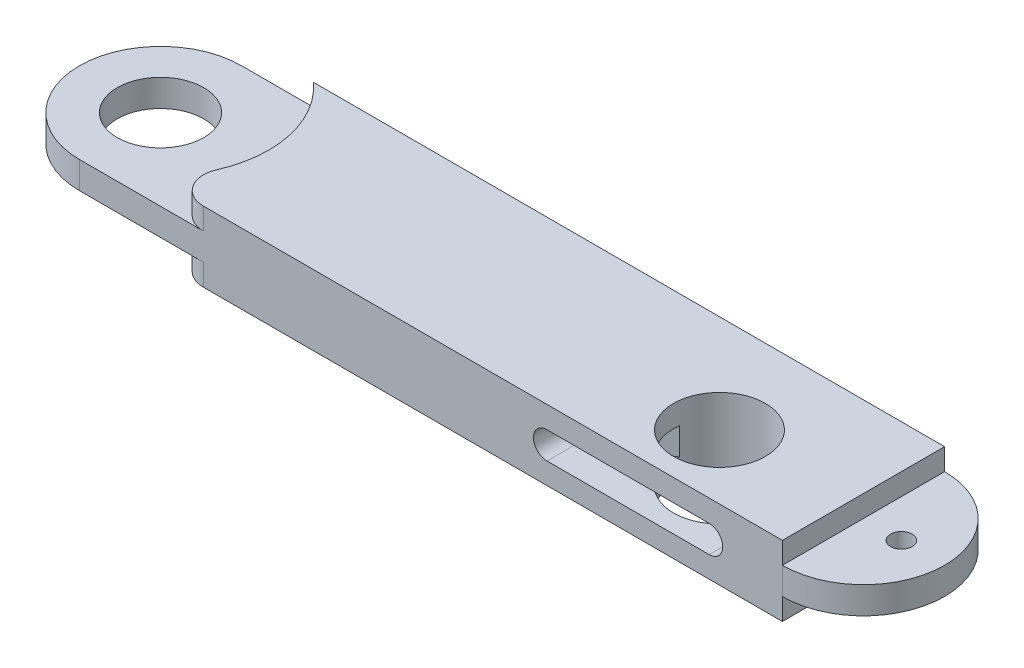
ISO-10303-21;
HEADER;
FILE_DESCRIPTION(('STEP AP214'),'2;1');
FILE_NAME('part.step','',(''),(''),'','','');
FILE_SCHEMA(('AUTOMOTIVE_DESIGN { 1 0 10303 214 1 1 1 1 }'));
ENDSEC;
DATA;
#1=APPLICATION_CONTEXT('core data for automotive mechanical design processes');
#2=APPLICATION_PROTOCOL_DEFINITION('international standard','automotive_design',2000,#1);
#3=PRODUCT_CONTEXT('',#1,'mechanical');
#4=PRODUCT('Part','Part','',(#3));
#5=PRODUCT_RELATED_PRODUCT_CATEGORY('part','',(#4));
#6=PRODUCT_DEFINITION_FORMATION('','',#4);
#7=PRODUCT_DEFINITION_CONTEXT('part definition',#1,'design');
#8=PRODUCT_DEFINITION('design','',#6,#7);
#9=PRODUCT_DEFINITION_SHAPE('','',#8);
#10=(LENGTH_UNIT() NAMED_UNIT(*) SI_UNIT(.MILLI.,.METRE.));
#11=(NAMED_UNIT(*) PLANE_ANGLE_UNIT() SI_UNIT($,.RADIAN.));
#12=(NAMED_UNIT(*) SI_UNIT($,.STERADIAN.) SOLID_ANGLE_UNIT());
#13=UNCERTAINTY_MEASURE_WITH_UNIT(LENGTH_MEASURE(1.E-05),#10,'distance_accuracy_value','');
#14=(GEOMETRIC_REPRESENTATION_CONTEXT(3) GLOBAL_UNCERTAINTY_ASSIGNED_CONTEXT((#13)) GLOBAL_UNIT_ASSIGNED_CONTEXT((#10,
#11,#12)) REPRESENTATION_CONTEXT('',''));
#15=CARTESIAN_POINT('',(0.,0.,0.));
#16=DIRECTION('',(0.,0.,1.));
#17=DIRECTION('',(1.,0.,0.));
#18=AXIS2_PLACEMENT_3D('',#15,#16,#17);
#19=CARTESIAN_POINT('',(0.,13.,0.));
#20=DIRECTION('',(0.,-1.,0.));
#21=DIRECTION('',(0.,0.,-1.));
#22=AXIS2_PLACEMENT_3D('',#19,#20,#21);
#23=CYLINDRICAL_SURFACE('',#22,15.);
#24=CARTESIAN_POINT('',(0.,4.,0.));
#25=DIRECTION('',(0.,-1.,0.));
#26=DIRECTION('',(0.,0.,-1.));
#27=AXIS2_PLACEMENT_3D('',#24,#25,#26);
#28=CIRCLE('',#27,15.);
#29=CARTESIAN_POINT('',(0.,4.,15.));
#30=VERTEX_POINT('',#29);
#31=CARTESIAN_POINT('',(0.,4.,-15.));
#32=VERTEX_POINT('',#31);
#33=EDGE_CURVE('E685',#30,#32,#28,.T.);
#34=ORIENTED_EDGE('',*,*,#33,.F.);
#35=DIRECTION('',(0.,-1.,0.));
#36=VECTOR('',#35,1.);
#37=CARTESIAN_POINT('',(0.,13.,15.));
#38=LINE('',#37,#36);
#39=CARTESIAN_POINT('',(0.,8.99999999999999,15.));
#40=VERTEX_POINT('',#39);
#41=EDGE_CURVE('E225',#40,#30,#38,.T.);
#42=ORIENTED_EDGE('',*,*,#41,.F.);
#43=CARTESIAN_POINT('',(0.,8.99999999999999,0.));
#44=DIRECTION('',(0.,1.,0.));
#45=DIRECTION('',(0.,0.,1.));
#46=AXIS2_PLACEMENT_3D('',#43,#44,#45);
#47=CIRCLE('',#46,15.);
#48=CARTESIAN_POINT('',(0.,8.99999999999999,-15.));
#49=VERTEX_POINT('',#48);
#50=EDGE_CURVE('E408',#49,#40,#47,.T.);
#51=ORIENTED_EDGE('',*,*,#50,.F.);
#52=DIRECTION('',(0.,-1.,0.));
#53=VECTOR('',#52,1.);
#54=CARTESIAN_POINT('',(0.,13.,-15.));
#55=LINE('',#54,#53);
#56=EDGE_CURVE('E212',#49,#32,#55,.T.);
#57=ORIENTED_EDGE('',*,*,#56,.T.);
#58=EDGE_LOOP('',(#34,#42,#51,#57));
#59=FACE_BOUND('',#58,.T.);
#60=ADVANCED_FACE('F38',(#59),#23,.T.);
#61=CARTESIAN_POINT('',(0.,13.,0.));
#62=DIRECTION('',(0.,-1.,0.));
#63=DIRECTION('',(0.,0.,-1.));
#64=AXIS2_PLACEMENT_3D('',#61,#62,#63);
#65=CYLINDRICAL_SURFACE('',#64,8.);
#66=CARTESIAN_POINT('',(0.,8.99999999999999,0.));
#67=DIRECTION('',(0.,1.,0.));
#68=DIRECTION('',(0.,0.,1.));
#69=AXIS2_PLACEMENT_3D('',#66,#67,#68);
#70=CIRCLE('',#69,8.);
#71=CARTESIAN_POINT('',(0.,8.99999999999999,8.));
#72=VERTEX_POINT('',#71);
#73=EDGE_CURVE('E237',#72,#72,#70,.T.);
#74=ORIENTED_EDGE('',*,*,#73,.T.);
#75=EDGE_LOOP('',(#74));
#76=FACE_BOUND('',#75,.T.);
#77=CARTESIAN_POINT('',(0.,4.,0.));
#78=DIRECTION('',(0.,-1.,0.));
#79=DIRECTION('',(0.,0.,-1.));
#80=AXIS2_PLACEMENT_3D('',#77,#78,#79);
#81=CIRCLE('',#80,8.);
#82=CARTESIAN_POINT('',(0.,4.,-8.));
#83=VERTEX_POINT('',#82);
#84=EDGE_CURVE('E397',#83,#83,#81,.T.);
#85=ORIENTED_EDGE('',*,*,#84,.T.);
#86=EDGE_LOOP('',(#85));
#87=FACE_BOUND('',#86,.T.);
#88=ADVANCED_FACE('F457',(#76,#87),#65,.F.);
#89=CARTESIAN_POINT('',(106.498459170401,13.,3.13660516722464));
#90=DIRECTION('',(0.,-1.,0.));
#91=DIRECTION('',(0.,0.,-1.));
#92=AXIS2_PLACEMENT_3D('',#89,#90,#91);
#93=CYLINDRICAL_SURFACE('',#92,8.50000000000001);
#94=CARTESIAN_POINT('',(106.498459170401,0.,3.13660516722464));
#95=DIRECTION('',(0.,-1.,0.));
#96=DIRECTION('',(0.,0.,-1.));
#97=AXIS2_PLACEMENT_3D('',#94,#95,#96);
#98=CIRCLE('',#97,8.50000000000001);
#99=CARTESIAN_POINT('',(106.498459170401,0.,-5.36339483277537));
#100=VERTEX_POINT('',#99);
#101=EDGE_CURVE('E337',#100,#100,#98,.T.);
#102=ORIENTED_EDGE('',*,*,#101,.T.);
#103=EDGE_LOOP('',(#102));
#104=FACE_BOUND('',#103,.T.);
#105=CARTESIAN_POINT('',(106.498459170401,13.,3.13660516722464));
#106=DIRECTION('',(0.,-1.,0.));
#107=DIRECTION('',(0.,0.,-1.));
#108=AXIS2_PLACEMENT_3D('',#105,#106,#107);
#109=CIRCLE('',#108,8.50000000000001);
#110=CARTESIAN_POINT('',(106.498459170401,13.,-5.36339483277537));
#111=VERTEX_POINT('',#110);
#112=EDGE_CURVE('E346',#111,#111,#109,.T.);
#113=ORIENTED_EDGE('',*,*,#112,.F.);
#114=EDGE_LOOP('',(#113));
#115=FACE_BOUND('',#114,.T.);
#116=CARTESIAN_POINT('',(106.498459170401,8.94488544016787,3.13660516722464));
#117=DIRECTION('',(0.,1.,0.));
#118=DIRECTION('',(0.,0.,1.));
#119=AXIS2_PLACEMENT_3D('',#116,#117,#118);
#120=CIRCLE('',#119,8.50000000000001);
#121=CARTESIAN_POINT('',(114.501644163367,8.94488544016787,6.00000000000001));
#122=VERTEX_POINT('',#121);
#123=CARTESIAN_POINT('',(98.0594527948272,8.94488544016787,2.12015477835988));
#124=VERTEX_POINT('',#123);
#125=EDGE_CURVE('E54',#122,#124,#120,.F.);
#126=ORIENTED_EDGE('',*,*,#125,.T.);
#127=DIRECTION('',(0.,-1.,0.));
#128=VECTOR('',#127,1.);
#129=CARTESIAN_POINT('',(98.0594527948272,13.,2.12015477835988));
#130=LINE('',#129,#128);
#131=CARTESIAN_POINT('',(98.0594527948272,3.94488544016787,2.12015477835989));
#132=VERTEX_POINT('',#131);
#133=EDGE_CURVE('E277',#124,#132,#130,.T.);
#134=ORIENTED_EDGE('',*,*,#133,.T.);
#135=CARTESIAN_POINT('',(106.498459170401,3.94488544016787,3.13660516722464));
#136=DIRECTION('',(0.,-1.,0.));
#137=DIRECTION('',(1.,0.,0.));
#138=AXIS2_PLACEMENT_3D('',#135,#136,#137);
#139=CIRCLE('',#138,8.50000000000001);
#140=CARTESIAN_POINT('',(114.501644163367,3.94488544016787,6.00000000000001));
#141=VERTEX_POINT('',#140);
#142=EDGE_CURVE('E61',#132,#141,#139,.F.);
#143=ORIENTED_EDGE('',*,*,#142,.T.);
#144=DIRECTION('',(0.,-1.,0.));
#145=VECTOR('',#144,1.);
#146=CARTESIAN_POINT('',(114.501644163367,13.,6.00000000000001));
#147=LINE('',#146,#145);
#148=EDGE_CURVE('E229',#122,#141,#147,.T.);
#149=ORIENTED_EDGE('',*,*,#148,.F.);
#150=EDGE_LOOP('',(#126,#134,#143,#149));
#151=FACE_BOUND('',#150,.T.);
#152=ADVANCED_FACE('F290',(#104,#115,#151),#93,.F.);
#153=CARTESIAN_POINT('',(0.,13.,0.));
#154=DIRECTION('',(0.,1.,0.));
#155=DIRECTION('',(0.,0.,1.));
#156=AXIS2_PLACEMENT_3D('',#153,#154,#155);
#157=PLANE('',#156);
#158=CARTESIAN_POINT('',(0.,13.,0.));
#159=DIRECTION('',(0.,1.,0.));
#160=DIRECTION('',(0.,0.,1.));
#161=AXIS2_PLACEMENT_3D('',#158,#159,#160);
#162=CIRCLE('',#161,20.0141798577134);
#163=CARTESIAN_POINT('',(18.3452787976229,13.,8.00113374556304));
#164=VERTEX_POINT('',#163);
#165=CARTESIAN_POINT('',(13.250184729916,13.,-15.));
#166=VERTEX_POINT('',#165);
#167=EDGE_CURVE('E387',#164,#166,#162,.T.);
#168=ORIENTED_EDGE('',*,*,#167,.F.);
#169=CARTESIAN_POINT('',(22.9283491327665,13.,10.));
#170=DIRECTION('',(0.,1.,0.));
#171=DIRECTION('',(0.,0.,1.));
#172=AXIS2_PLACEMENT_3D('',#169,#170,#171);
#173=CIRCLE('',#172,5.);
#174=CARTESIAN_POINT('',(22.9283491327665,13.,15.));
#175=VERTEX_POINT('',#174);
#176=EDGE_CURVE('E267',#164,#175,#173,.T.);
#177=ORIENTED_EDGE('',*,*,#176,.T.);
#178=DIRECTION('',(1.,0.,0.));
#179=VECTOR('',#178,1.);
#180=CARTESIAN_POINT('',(0.,13.,15.));
#181=LINE('',#180,#179);
#182=CARTESIAN_POINT('',(130.,13.,15.));
#183=VERTEX_POINT('',#182);
#184=EDGE_CURVE('E201',#175,#183,#181,.T.);
#185=ORIENTED_EDGE('',*,*,#184,.T.);
#186=DIRECTION('',(0.,0.,1.));
#187=VECTOR('',#186,1.);
#188=CARTESIAN_POINT('',(130.,13.,-15.));
#189=LINE('',#188,#187);
#190=CARTESIAN_POINT('',(130.,13.,-15.));
#191=VERTEX_POINT('',#190);
#192=EDGE_CURVE('E366',#191,#183,#189,.T.);
#193=ORIENTED_EDGE('',*,*,#192,.F.);
#194=DIRECTION('',(-1.,0.,0.));
#195=VECTOR('',#194,1.);
#196=CARTESIAN_POINT('',(0.,13.,-15.));
#197=LINE('',#196,#195);
#198=EDGE_CURVE('E206',#191,#166,#197,.T.);
#199=ORIENTED_EDGE('',*,*,#198,.T.);
#200=EDGE_LOOP('',(#168,#177,#185,#193,#199));
#201=FACE_BOUND('',#200,.T.);
#202=ORIENTED_EDGE('',*,*,#112,.T.);
#203=EDGE_LOOP('',(#202));
#204=FACE_BOUND('',#203,.T.);
#205=ADVANCED_FACE('F385',(#201,#204),#157,.T.);
#206=CARTESIAN_POINT('',(0.,0.,0.));
#207=DIRECTION('',(0.,1.,0.));
#208=DIRECTION('',(0.,0.,1.));
#209=AXIS2_PLACEMENT_3D('',#206,#207,#208);
#210=PLANE('',#209);
#211=ORIENTED_EDGE('',*,*,#101,.F.);
#212=EDGE_LOOP('',(#211));
#213=FACE_BOUND('',#212,.T.);
#214=DIRECTION('',(1.,0.,0.));
#215=VECTOR('',#214,1.);
#216=CARTESIAN_POINT('',(0.,0.,15.));
#217=LINE('',#216,#215);
#218=CARTESIAN_POINT('',(22.9283491327665,0.,15.));
#219=VERTEX_POINT('',#218);
#220=CARTESIAN_POINT('',(130.,0.,15.));
#221=VERTEX_POINT('',#220);
#222=EDGE_CURVE('E202',#219,#221,#217,.T.);
#223=ORIENTED_EDGE('',*,*,#222,.F.);
#224=CARTESIAN_POINT('',(22.9283491327665,0.,10.));
#225=DIRECTION('',(0.,1.,0.));
#226=DIRECTION('',(0.,0.,1.));
#227=AXIS2_PLACEMENT_3D('',#224,#225,#226);
#228=CIRCLE('',#227,5.);
#229=CARTESIAN_POINT('',(18.3452787976229,0.,8.00113374556304));
#230=VERTEX_POINT('',#229);
#231=EDGE_CURVE('E192',#219,#230,#228,.F.);
#232=ORIENTED_EDGE('',*,*,#231,.T.);
#233=CARTESIAN_POINT('',(0.,0.,0.));
#234=DIRECTION('',(0.,-1.,0.));
#235=DIRECTION('',(0.,0.,-1.));
#236=AXIS2_PLACEMENT_3D('',#233,#234,#235);
#237=CIRCLE('',#236,20.0141798577134);
#238=CARTESIAN_POINT('',(13.250184729916,0.,-15.));
#239=VERTEX_POINT('',#238);
#240=EDGE_CURVE('E175',#239,#230,#237,.T.);
#241=ORIENTED_EDGE('',*,*,#240,.F.);
#242=DIRECTION('',(-1.,0.,0.));
#243=VECTOR('',#242,1.);
#244=CARTESIAN_POINT('',(0.,0.,-15.));
#245=LINE('',#244,#243);
#246=CARTESIAN_POINT('',(130.,0.,-15.));
#247=VERTEX_POINT('',#246);
#248=EDGE_CURVE('E191',#247,#239,#245,.T.);
#249=ORIENTED_EDGE('',*,*,#248,.F.);
#250=DIRECTION('',(0.,0.,-1.));
#251=VECTOR('',#250,1.);
#252=CARTESIAN_POINT('',(130.,0.,15.));
#253=LINE('',#252,#251);
#254=EDGE_CURVE('E350',#221,#247,#253,.T.);
#255=ORIENTED_EDGE('',*,*,#254,.F.);
#256=EDGE_LOOP('',(#223,#232,#241,#249,#255));
#257=FACE_BOUND('',#256,.T.);
#258=ADVANCED_FACE('F189',(#213,#257),#210,.F.);
#259=CARTESIAN_POINT('',(0.,13.,15.));
#260=DIRECTION('',(0.,0.,-1.));
#261=DIRECTION('',(-1.,0.,0.));
#262=AXIS2_PLACEMENT_3D('',#259,#260,#261);
#263=PLANE('',#262);
#264=DIRECTION('',(1.,0.,0.));
#265=VECTOR('',#264,1.);
#266=CARTESIAN_POINT('',(86.4681168332875,3.94488544016787,15.));
#267=LINE('',#266,#265);
#268=CARTESIAN_POINT('',(86.4681168332875,3.94488544016787,15.));
#269=VERTEX_POINT('',#268);
#270=CARTESIAN_POINT('',(116.468116833288,3.94488544016787,15.));
#271=VERTEX_POINT('',#270);
#272=EDGE_CURVE('E323',#269,#271,#267,.T.);
#273=ORIENTED_EDGE('',*,*,#272,.F.);
#274=CARTESIAN_POINT('',(86.4681168332875,6.44488544016787,15.));
#275=DIRECTION('',(0.,0.,1.));
#276=DIRECTION('',(1.,0.,0.));
#277=AXIS2_PLACEMENT_3D('',#274,#275,#276);
#278=CIRCLE('',#277,2.5);
#279=CARTESIAN_POINT('',(86.4681168332875,8.94488544016787,15.));
#280=VERTEX_POINT('',#279);
#281=EDGE_CURVE('E320',#280,#269,#278,.T.);
#282=ORIENTED_EDGE('',*,*,#281,.F.);
#283=DIRECTION('',(-1.,0.,0.));
#284=VECTOR('',#283,1.);
#285=CARTESIAN_POINT('',(86.4681168332875,8.94488544016787,15.));
#286=LINE('',#285,#284);
#287=CARTESIAN_POINT('',(116.468116833288,8.94488544016787,15.));
#288=VERTEX_POINT('',#287);
#289=EDGE_CURVE('E311',#288,#280,#286,.T.);
#290=ORIENTED_EDGE('',*,*,#289,.F.);
#291=CARTESIAN_POINT('',(116.468116833288,6.44488544016787,15.));
#292=DIRECTION('',(0.,0.,1.));
#293=DIRECTION('',(1.,0.,0.));
#294=AXIS2_PLACEMENT_3D('',#291,#292,#293);
#295=CIRCLE('',#294,2.5);
#296=EDGE_CURVE('E327',#271,#288,#295,.T.);
#297=ORIENTED_EDGE('',*,*,#296,.F.);
#298=EDGE_LOOP('',(#273,#282,#290,#297));
#299=FACE_BOUND('',#298,.T.);
#300=ORIENTED_EDGE('',*,*,#184,.F.);
#301=DIRECTION('',(0.,1.,0.));
#302=VECTOR('',#301,1.);
#303=CARTESIAN_POINT('',(22.9283491327665,13.,15.));
#304=LINE('',#303,#302);
#305=CARTESIAN_POINT('',(22.9283491327665,8.99999999999999,15.));
#306=VERTEX_POINT('',#305);
#307=EDGE_CURVE('E260',#175,#306,#304,.F.);
#308=ORIENTED_EDGE('',*,*,#307,.T.);
#309=DIRECTION('',(1.,0.,0.));
#310=VECTOR('',#309,1.);
#311=CARTESIAN_POINT('',(0.,8.99999999999999,15.));
#312=LINE('',#311,#310);
#313=EDGE_CURVE('E324',#40,#306,#312,.T.);
#314=ORIENTED_EDGE('',*,*,#313,.F.);
#315=ORIENTED_EDGE('',*,*,#41,.T.);
#316=DIRECTION('',(-1.,0.,0.));
#317=VECTOR('',#316,1.);
#318=CARTESIAN_POINT('',(0.,4.,15.));
#319=LINE('',#318,#317);
#320=CARTESIAN_POINT('',(22.9283491327665,4.,15.));
#321=VERTEX_POINT('',#320);
#322=EDGE_CURVE('E403',#321,#30,#319,.T.);
#323=ORIENTED_EDGE('',*,*,#322,.F.);
#324=DIRECTION('',(0.,-1.,0.));
#325=VECTOR('',#324,1.);
#326=CARTESIAN_POINT('',(22.9283491327665,13.,15.));
#327=LINE('',#326,#325);
#328=EDGE_CURVE('E183',#321,#219,#327,.T.);
#329=ORIENTED_EDGE('',*,*,#328,.T.);
#330=ORIENTED_EDGE('',*,*,#222,.T.);
#331=DIRECTION('',(0.,-1.,0.));
#332=VECTOR('',#331,1.);
#333=CARTESIAN_POINT('',(130.,4.,15.));
#334=LINE('',#333,#332);
#335=CARTESIAN_POINT('',(130.,4.,15.));
#336=VERTEX_POINT('',#335);
#337=EDGE_CURVE('E361',#336,#221,#334,.T.);
#338=ORIENTED_EDGE('',*,*,#337,.F.);
#339=DIRECTION('',(0.,-1.,0.));
#340=VECTOR('',#339,1.);
#341=CARTESIAN_POINT('',(130.,13.,15.));
#342=LINE('',#341,#340);
#343=CARTESIAN_POINT('',(130.,9.,15.));
#344=VERTEX_POINT('',#343);
#345=EDGE_CURVE('E221',#344,#336,#342,.T.);
#346=ORIENTED_EDGE('',*,*,#345,.F.);
#347=EDGE_CURVE('E222',#183,#344,#342,.T.);
#348=ORIENTED_EDGE('',*,*,#347,.F.);
#349=EDGE_LOOP('',(#300,#308,#314,#315,#323,#329,#330,#338,#346,#348));
#350=FACE_BOUND('',#349,.T.);
#351=ADVANCED_FACE('F422',(#299,#350),#263,.F.);
#352=CARTESIAN_POINT('',(130.,13.,0.));
#353=DIRECTION('',(0.,-1.,0.));
#354=DIRECTION('',(0.,0.,-1.));
#355=AXIS2_PLACEMENT_3D('',#352,#353,#354);
#356=CYLINDRICAL_SURFACE('',#355,15.);
#357=ORIENTED_EDGE('',*,*,#345,.T.);
#358=CARTESIAN_POINT('',(130.,4.,0.));
#359=DIRECTION('',(0.,-1.,0.));
#360=DIRECTION('',(0.,0.,1.));
#361=AXIS2_PLACEMENT_3D('',#358,#359,#360);
#362=CIRCLE('',#361,15.);
#363=CARTESIAN_POINT('',(130.,4.,-15.));
#364=VERTEX_POINT('',#363);
#365=EDGE_CURVE('E354',#364,#336,#362,.T.);
#366=ORIENTED_EDGE('',*,*,#365,.F.);
#367=DIRECTION('',(0.,-1.,0.));
#368=VECTOR('',#367,1.);
#369=CARTESIAN_POINT('',(130.,13.,-15.));
#370=LINE('',#369,#368);
#371=CARTESIAN_POINT('',(130.,9.,-15.));
#372=VERTEX_POINT('',#371);
#373=EDGE_CURVE('E216',#372,#364,#370,.T.);
#374=ORIENTED_EDGE('',*,*,#373,.F.);
#375=CARTESIAN_POINT('',(130.,9.,0.));
#376=DIRECTION('',(0.,1.,0.));
#377=DIRECTION('',(0.,0.,-1.));
#378=AXIS2_PLACEMENT_3D('',#375,#376,#377);
#379=CIRCLE('',#378,15.);
#380=EDGE_CURVE('E370',#344,#372,#379,.T.);
#381=ORIENTED_EDGE('',*,*,#380,.F.);
#382=EDGE_LOOP('',(#357,#366,#374,#381));
#383=FACE_BOUND('',#382,.T.);
#384=ADVANCED_FACE('F434',(#383),#356,.T.);
#385=CARTESIAN_POINT('',(0.,13.,-15.));
#386=DIRECTION('',(0.,0.,1.));
#387=DIRECTION('',(1.,0.,0.));
#388=AXIS2_PLACEMENT_3D('',#385,#386,#387);
#389=PLANE('',#388);
#390=ORIENTED_EDGE('',*,*,#248,.T.);
#391=DIRECTION('',(0.,-1.,0.));
#392=VECTOR('',#391,1.);
#393=CARTESIAN_POINT('',(13.250184729916,4.,-15.));
#394=LINE('',#393,#392);
#395=CARTESIAN_POINT('',(13.250184729916,4.,-15.));
#396=VERTEX_POINT('',#395);
#397=EDGE_CURVE('E172',#239,#396,#394,.F.);
#398=ORIENTED_EDGE('',*,*,#397,.T.);
#399=DIRECTION('',(1.,0.,0.));
#400=VECTOR('',#399,1.);
#401=CARTESIAN_POINT('',(0.,4.,-15.));
#402=LINE('',#401,#400);
#403=EDGE_CURVE('E184',#32,#396,#402,.T.);
#404=ORIENTED_EDGE('',*,*,#403,.F.);
#405=ORIENTED_EDGE('',*,*,#56,.F.);
#406=DIRECTION('',(-1.,0.,0.));
#407=VECTOR('',#406,1.);
#408=CARTESIAN_POINT('',(0.,8.99999999999999,-15.));
#409=LINE('',#408,#407);
#410=CARTESIAN_POINT('',(13.250184729916,8.99999999999999,-15.));
#411=VERTEX_POINT('',#410);
#412=EDGE_CURVE('E241',#411,#49,#409,.T.);
#413=ORIENTED_EDGE('',*,*,#412,.F.);
#414=DIRECTION('',(0.,1.,0.));
#415=VECTOR('',#414,1.);
#416=CARTESIAN_POINT('',(13.250184729916,8.99999999999999,-15.));
#417=LINE('',#416,#415);
#418=EDGE_CURVE('E236',#411,#166,#417,.T.);
#419=ORIENTED_EDGE('',*,*,#418,.T.);
#420=ORIENTED_EDGE('',*,*,#198,.F.);
#421=EDGE_CURVE('E217',#191,#372,#370,.T.);
#422=ORIENTED_EDGE('',*,*,#421,.T.);
#423=ORIENTED_EDGE('',*,*,#373,.T.);
#424=DIRECTION('',(0.,-1.,0.));
#425=VECTOR('',#424,1.);
#426=CARTESIAN_POINT('',(130.,4.,-15.));
#427=LINE('',#426,#425);
#428=EDGE_CURVE('E199',#364,#247,#427,.T.);
#429=ORIENTED_EDGE('',*,*,#428,.T.);
#430=EDGE_LOOP('',(#390,#398,#404,#405,#413,#419,#420,#422,#423,#429));
#431=FACE_BOUND('',#430,.T.);
#432=ADVANCED_FACE('F197',(#431),#389,.F.);
#433=CARTESIAN_POINT('',(130.,9.,-15.));
#434=DIRECTION('',(-1.,0.,0.));
#435=DIRECTION('',(0.,0.,1.));
#436=AXIS2_PLACEMENT_3D('',#433,#434,#435);
#437=PLANE('',#436);
#438=ORIENTED_EDGE('',*,*,#192,.T.);
#439=ORIENTED_EDGE('',*,*,#347,.T.);
#440=DIRECTION('',(0.,0.,1.));
#441=VECTOR('',#440,1.);
#442=CARTESIAN_POINT('',(130.,9.,-15.));
#443=LINE('',#442,#441);
#444=EDGE_CURVE('E208',#372,#344,#443,.T.);
#445=ORIENTED_EDGE('',*,*,#444,.F.);
#446=ORIENTED_EDGE('',*,*,#421,.F.);
#447=EDGE_LOOP('',(#438,#439,#445,#446));
#448=FACE_BOUND('',#447,.T.);
#449=ADVANCED_FACE('F426',(#448),#437,.F.);
#450=CARTESIAN_POINT('',(130.,9.,0.));
#451=DIRECTION('',(0.,-1.,0.));
#452=DIRECTION('',(0.,0.,-1.));
#453=AXIS2_PLACEMENT_3D('',#450,#451,#452);
#454=PLANE('',#453);
#455=CARTESIAN_POINT('',(137.,9.,0.));
#456=DIRECTION('',(0.,1.,0.));
#457=DIRECTION('',(0.,0.,1.));
#458=AXIS2_PLACEMENT_3D('',#455,#456,#457);
#459=CIRCLE('',#458,2.);
#460=CARTESIAN_POINT('',(137.,9.,1.99999999999999));
#461=VERTEX_POINT('',#460);
#462=EDGE_CURVE('E678',#461,#461,#459,.T.);
#463=ORIENTED_EDGE('',*,*,#462,.F.);
#464=EDGE_LOOP('',(#463));
#465=FACE_BOUND('',#464,.T.);
#466=ORIENTED_EDGE('',*,*,#380,.T.);
#467=ORIENTED_EDGE('',*,*,#444,.T.);
#468=EDGE_LOOP('',(#466,#467));
#469=FACE_BOUND('',#468,.T.);
#470=ADVANCED_FACE('F430',(#465,#469),#454,.F.);
#471=CARTESIAN_POINT('',(130.,4.,15.));
#472=DIRECTION('',(-1.,0.,0.));
#473=DIRECTION('',(0.,0.,1.));
#474=AXIS2_PLACEMENT_3D('',#471,#472,#473);
#475=PLANE('',#474);
#476=ORIENTED_EDGE('',*,*,#254,.T.);
#477=ORIENTED_EDGE('',*,*,#428,.F.);
#478=DIRECTION('',(0.,0.,-1.));
#479=VECTOR('',#478,1.);
#480=CARTESIAN_POINT('',(130.,4.,15.));
#481=LINE('',#480,#479);
#482=EDGE_CURVE('E357',#336,#364,#481,.T.);
#483=ORIENTED_EDGE('',*,*,#482,.F.);
#484=ORIENTED_EDGE('',*,*,#337,.T.);
#485=EDGE_LOOP('',(#476,#477,#483,#484));
#486=FACE_BOUND('',#485,.T.);
#487=ADVANCED_FACE('F440',(#486),#475,.F.);
#488=CARTESIAN_POINT('',(130.,4.,0.));
#489=DIRECTION('',(0.,1.,0.));
#490=DIRECTION('',(0.,0.,1.));
#491=AXIS2_PLACEMENT_3D('',#488,#489,#490);
#492=PLANE('',#491);
#493=CARTESIAN_POINT('',(137.,4.,0.));
#494=DIRECTION('',(0.,1.,0.));
#495=DIRECTION('',(0.,0.,1.));
#496=AXIS2_PLACEMENT_3D('',#493,#494,#495);
#497=CIRCLE('',#496,2.);
#498=CARTESIAN_POINT('',(137.,4.,1.99999999999999));
#499=VERTEX_POINT('',#498);
#500=EDGE_CURVE('E194',#499,#499,#497,.T.);
#501=ORIENTED_EDGE('',*,*,#500,.T.);
#502=EDGE_LOOP('',(#501));
#503=FACE_BOUND('',#502,.T.);
#504=ORIENTED_EDGE('',*,*,#365,.T.);
#505=ORIENTED_EDGE('',*,*,#482,.T.);
#506=EDGE_LOOP('',(#504,#505));
#507=FACE_BOUND('',#506,.T.);
#508=ADVANCED_FACE('F442',(#503,#507),#492,.F.);
#509=CARTESIAN_POINT('',(86.4681168332875,8.94488544016787,6.00000000000001));
#510=DIRECTION('',(0.,1.,0.));
#511=DIRECTION('',(0.,0.,1.));
#512=AXIS2_PLACEMENT_3D('',#509,#510,#511);
#513=PLANE('',#512);
#514=DIRECTION('',(-1.,0.,0.));
#515=VECTOR('',#514,1.);
#516=CARTESIAN_POINT('',(86.4681168332875,8.94488544016787,6.00000000000001));
#517=LINE('',#516,#515);
#518=CARTESIAN_POINT('',(116.468116833288,8.94488544016787,6.00000000000001));
#519=VERTEX_POINT('',#518);
#520=EDGE_CURVE('E296',#519,#122,#517,.T.);
#521=ORIENTED_EDGE('',*,*,#520,.F.);
#522=DIRECTION('',(0.,0.,1.));
#523=VECTOR('',#522,1.);
#524=CARTESIAN_POINT('',(116.468116833288,8.94488544016787,6.00000000000001));
#525=LINE('',#524,#523);
#526=EDGE_CURVE('E338',#519,#288,#525,.T.);
#527=ORIENTED_EDGE('',*,*,#526,.T.);
#528=ORIENTED_EDGE('',*,*,#289,.T.);
#529=DIRECTION('',(0.,0.,1.));
#530=VECTOR('',#529,1.);
#531=CARTESIAN_POINT('',(86.4681168332875,8.94488544016787,6.00000000000001));
#532=LINE('',#531,#530);
#533=CARTESIAN_POINT('',(86.4681168332875,8.94488544016787,6.00000000000001));
#534=VERTEX_POINT('',#533);
#535=EDGE_CURVE('E334',#534,#280,#532,.T.);
#536=ORIENTED_EDGE('',*,*,#535,.F.);
#537=CARTESIAN_POINT('',(92.1627598210972,8.94488544016787,6.00000000000001));
#538=VERTEX_POINT('',#537);
#539=EDGE_CURVE('E286',#538,#534,#517,.T.);
#540=ORIENTED_EDGE('',*,*,#539,.F.);
#541=DIRECTION('',(0.835388332573841,0.,-0.549660198485845));
#542=VECTOR('',#541,1.);
#543=CARTESIAN_POINT('',(88.1886184414915,8.94488544016787,8.61486455382331));
#544=LINE('',#543,#542);
#545=EDGE_CURVE('E47',#538,#124,#544,.T.);
#546=ORIENTED_EDGE('',*,*,#545,.T.);
#547=ORIENTED_EDGE('',*,*,#125,.F.);
#548=EDGE_LOOP('',(#521,#527,#528,#536,#540,#546,#547));
#549=FACE_BOUND('',#548,.T.);
#550=ADVANCED_FACE('F284',(#549),#513,.F.);
#551=CARTESIAN_POINT('',(86.4681168332875,3.94488544016787,6.00000000000001));
#552=DIRECTION('',(0.,-1.,0.));
#553=DIRECTION('',(1.,0.,0.));
#554=AXIS2_PLACEMENT_3D('',#551,#552,#553);
#555=PLANE('',#554);
#556=DIRECTION('',(1.,0.,0.));
#557=VECTOR('',#556,1.);
#558=CARTESIAN_POINT('',(86.4681168332875,3.94488544016787,6.00000000000001));
#559=LINE('',#558,#557);
#560=CARTESIAN_POINT('',(86.4681168332875,3.94488544016787,6.00000000000001));
#561=VERTEX_POINT('',#560);
#562=CARTESIAN_POINT('',(92.1627598210972,3.94488544016787,6.00000000000001));
#563=VERTEX_POINT('',#562);
#564=EDGE_CURVE('E303',#561,#563,#559,.T.);
#565=ORIENTED_EDGE('',*,*,#564,.F.);
#566=DIRECTION('',(0.,0.,1.));
#567=VECTOR('',#566,1.);
#568=CARTESIAN_POINT('',(86.4681168332875,3.94488544016787,6.00000000000001));
#569=LINE('',#568,#567);
#570=EDGE_CURVE('E319',#561,#269,#569,.T.);
#571=ORIENTED_EDGE('',*,*,#570,.T.);
#572=ORIENTED_EDGE('',*,*,#272,.T.);
#573=DIRECTION('',(0.,0.,1.));
#574=VECTOR('',#573,1.);
#575=CARTESIAN_POINT('',(116.468116833288,3.94488544016787,6.00000000000001));
#576=LINE('',#575,#574);
#577=CARTESIAN_POINT('',(116.468116833288,3.94488544016787,6.00000000000001));
#578=VERTEX_POINT('',#577);
#579=EDGE_CURVE('E300',#578,#271,#576,.T.);
#580=ORIENTED_EDGE('',*,*,#579,.F.);
#581=EDGE_CURVE('E294',#141,#578,#559,.T.);
#582=ORIENTED_EDGE('',*,*,#581,.F.);
#583=ORIENTED_EDGE('',*,*,#142,.F.);
#584=DIRECTION('',(-0.835388332573841,0.,0.549660198485845));
#585=VECTOR('',#584,1.);
#586=CARTESIAN_POINT('',(88.1886184414915,3.94488544016787,8.61486455382331));
#587=LINE('',#586,#585);
#588=EDGE_CURVE('E11',#132,#563,#587,.T.);
#589=ORIENTED_EDGE('',*,*,#588,.T.);
#590=EDGE_LOOP('',(#565,#571,#572,#580,#582,#583,#589));
#591=FACE_BOUND('',#590,.T.);
#592=ADVANCED_FACE('F298',(#591),#555,.F.);
#593=CARTESIAN_POINT('',(86.4681168332875,6.44488544016787,6.00000000000001));
#594=DIRECTION('',(0.,0.,1.));
#595=DIRECTION('',(1.,0.,0.));
#596=AXIS2_PLACEMENT_3D('',#593,#594,#595);
#597=PLANE('',#596);
#598=ORIENTED_EDGE('',*,*,#564,.T.);
#599=DIRECTION('',(0.,1.,0.));
#600=VECTOR('',#599,1.);
#601=CARTESIAN_POINT('',(92.1627598210972,8.94488544016787,6.00000000000001));
#602=LINE('',#601,#600);
#603=EDGE_CURVE('E273',#563,#538,#602,.T.);
#604=ORIENTED_EDGE('',*,*,#603,.T.);
#605=ORIENTED_EDGE('',*,*,#539,.T.);
#606=CARTESIAN_POINT('',(86.4681168332875,6.44488544016787,6.00000000000001));
#607=DIRECTION('',(0.,0.,1.));
#608=DIRECTION('',(1.,0.,0.));
#609=AXIS2_PLACEMENT_3D('',#606,#607,#608);
#610=CIRCLE('',#609,2.5);
#611=EDGE_CURVE('E304',#534,#561,#610,.T.);
#612=ORIENTED_EDGE('',*,*,#611,.T.);
#613=EDGE_LOOP('',(#598,#604,#605,#612));
#614=FACE_BOUND('',#613,.T.);
#615=ADVANCED_FACE('F496',(#614),#597,.T.);
#616=ORIENTED_EDGE('',*,*,#148,.T.);
#617=ORIENTED_EDGE('',*,*,#581,.T.);
#618=CARTESIAN_POINT('',(116.468116833288,6.44488544016787,6.00000000000001));
#619=DIRECTION('',(0.,0.,1.));
#620=DIRECTION('',(1.,0.,0.));
#621=AXIS2_PLACEMENT_3D('',#618,#619,#620);
#622=CIRCLE('',#621,2.5);
#623=EDGE_CURVE('E309',#578,#519,#622,.T.);
#624=ORIENTED_EDGE('',*,*,#623,.T.);
#625=ORIENTED_EDGE('',*,*,#520,.T.);
#626=EDGE_LOOP('',(#616,#617,#624,#625));
#627=FACE_BOUND('',#626,.T.);
#628=ADVANCED_FACE('F292',(#627),#597,.T.);
#629=CARTESIAN_POINT('',(86.4681168332875,6.44488544016787,6.00000000000001));
#630=DIRECTION('',(0.,0.,1.));
#631=DIRECTION('',(1.,0.,0.));
#632=AXIS2_PLACEMENT_3D('',#629,#630,#631);
#633=CYLINDRICAL_SURFACE('',#632,2.5);
#634=ORIENTED_EDGE('',*,*,#281,.T.);
#635=ORIENTED_EDGE('',*,*,#570,.F.);
#636=ORIENTED_EDGE('',*,*,#611,.F.);
#637=ORIENTED_EDGE('',*,*,#535,.T.);
#638=EDGE_LOOP('',(#634,#635,#636,#637));
#639=FACE_BOUND('',#638,.T.);
#640=ADVANCED_FACE('F502',(#639),#633,.F.);
#641=CARTESIAN_POINT('',(116.468116833288,6.44488544016787,6.00000000000001));
#642=DIRECTION('',(0.,0.,1.));
#643=DIRECTION('',(1.,0.,0.));
#644=AXIS2_PLACEMENT_3D('',#641,#642,#643);
#645=CYLINDRICAL_SURFACE('',#644,2.5);
#646=ORIENTED_EDGE('',*,*,#296,.T.);
#647=ORIENTED_EDGE('',*,*,#526,.F.);
#648=ORIENTED_EDGE('',*,*,#623,.F.);
#649=ORIENTED_EDGE('',*,*,#579,.T.);
#650=EDGE_LOOP('',(#646,#647,#648,#649));
#651=FACE_BOUND('',#650,.T.);
#652=ADVANCED_FACE('F495',(#651),#645,.F.);
#653=CARTESIAN_POINT('',(0.,8.99999999999999,0.));
#654=DIRECTION('',(0.,1.,0.));
#655=DIRECTION('',(0.,0.,1.));
#656=AXIS2_PLACEMENT_3D('',#653,#654,#655);
#657=CYLINDRICAL_SURFACE('',#656,20.0141798577134);
#658=CARTESIAN_POINT('',(0.,8.99999999999999,0.));
#659=DIRECTION('',(0.,1.,0.));
#660=DIRECTION('',(0.,0.,1.));
#661=AXIS2_PLACEMENT_3D('',#658,#659,#660);
#662=CIRCLE('',#661,20.0141798577134);
#663=CARTESIAN_POINT('',(18.3452787976229,8.99999999999999,8.00113374556304));
#664=VERTEX_POINT('',#663);
#665=EDGE_CURVE('E242',#664,#411,#662,.T.);
#666=ORIENTED_EDGE('',*,*,#665,.F.);
#667=DIRECTION('',(0.,1.,0.));
#668=VECTOR('',#667,1.);
#669=CARTESIAN_POINT('',(18.3452787976229,8.99999999999999,8.00113374556304));
#670=LINE('',#669,#668);
#671=EDGE_CURVE('E264',#664,#164,#670,.T.);
#672=ORIENTED_EDGE('',*,*,#671,.T.);
#673=ORIENTED_EDGE('',*,*,#167,.T.);
#674=ORIENTED_EDGE('',*,*,#418,.F.);
#675=EDGE_LOOP('',(#666,#672,#673,#674));
#676=FACE_BOUND('',#675,.T.);
#677=ADVANCED_FACE('F394',(#676),#657,.F.);
#678=CARTESIAN_POINT('',(0.,8.99999999999999,0.));
#679=DIRECTION('',(0.,1.,0.));
#680=DIRECTION('',(0.,0.,1.));
#681=AXIS2_PLACEMENT_3D('',#678,#679,#680);
#682=PLANE('',#681);
#683=ORIENTED_EDGE('',*,*,#73,.F.);
#684=EDGE_LOOP('',(#683));
#685=FACE_BOUND('',#684,.T.);
#686=ORIENTED_EDGE('',*,*,#313,.T.);
#687=CARTESIAN_POINT('',(22.9283491327665,8.99999999999999,10.));
#688=DIRECTION('',(0.,1.,0.));
#689=DIRECTION('',(0.,0.,1.));
#690=AXIS2_PLACEMENT_3D('',#687,#688,#689);
#691=CIRCLE('',#690,5.);
#692=EDGE_CURVE('E270',#306,#664,#691,.F.);
#693=ORIENTED_EDGE('',*,*,#692,.T.);
#694=ORIENTED_EDGE('',*,*,#665,.T.);
#695=ORIENTED_EDGE('',*,*,#412,.T.);
#696=ORIENTED_EDGE('',*,*,#50,.T.);
#697=EDGE_LOOP('',(#686,#693,#694,#695,#696));
#698=FACE_BOUND('',#697,.T.);
#699=ADVANCED_FACE('F414',(#685,#698),#682,.T.);
#700=CARTESIAN_POINT('',(0.,4.,0.));
#701=DIRECTION('',(0.,-1.,0.));
#702=DIRECTION('',(0.,0.,-1.));
#703=AXIS2_PLACEMENT_3D('',#700,#701,#702);
#704=CYLINDRICAL_SURFACE('',#703,20.0141798577134);
#705=ORIENTED_EDGE('',*,*,#240,.T.);
#706=DIRECTION('',(0.,-1.,0.));
#707=VECTOR('',#706,1.);
#708=CARTESIAN_POINT('',(18.3452787976229,4.,8.00113374556304));
#709=LINE('',#708,#707);
#710=CARTESIAN_POINT('',(18.3452787976229,4.,8.00113374556304));
#711=VERTEX_POINT('',#710);
#712=EDGE_CURVE('E253',#230,#711,#709,.F.);
#713=ORIENTED_EDGE('',*,*,#712,.T.);
#714=CARTESIAN_POINT('',(0.,4.,0.));
#715=DIRECTION('',(0.,-1.,0.));
#716=DIRECTION('',(0.,0.,-1.));
#717=AXIS2_PLACEMENT_3D('',#714,#715,#716);
#718=CIRCLE('',#717,20.0141798577134);
#719=EDGE_CURVE('E178',#396,#711,#718,.T.);
#720=ORIENTED_EDGE('',*,*,#719,.F.);
#721=ORIENTED_EDGE('',*,*,#397,.F.);
#722=EDGE_LOOP('',(#705,#713,#720,#721));
#723=FACE_BOUND('',#722,.T.);
#724=ADVANCED_FACE('F174',(#723),#704,.F.);
#725=CARTESIAN_POINT('',(0.,4.,0.));
#726=DIRECTION('',(0.,-1.,0.));
#727=DIRECTION('',(0.,0.,-1.));
#728=AXIS2_PLACEMENT_3D('',#725,#726,#727);
#729=PLANE('',#728);
#730=ORIENTED_EDGE('',*,*,#84,.F.);
#731=EDGE_LOOP('',(#730));
#732=FACE_BOUND('',#731,.T.);
#733=ORIENTED_EDGE('',*,*,#322,.T.);
#734=ORIENTED_EDGE('',*,*,#33,.T.);
#735=ORIENTED_EDGE('',*,*,#403,.T.);
#736=ORIENTED_EDGE('',*,*,#719,.T.);
#737=CARTESIAN_POINT('',(22.9283491327665,4.,10.));
#738=DIRECTION('',(0.,-1.,0.));
#739=DIRECTION('',(0.,0.,-1.));
#740=AXIS2_PLACEMENT_3D('',#737,#738,#739);
#741=CIRCLE('',#740,5.);
#742=EDGE_CURVE('E256',#711,#321,#741,.F.);
#743=ORIENTED_EDGE('',*,*,#742,.T.);
#744=EDGE_LOOP('',(#733,#734,#735,#736,#743));
#745=FACE_BOUND('',#744,.T.);
#746=ADVANCED_FACE('F471',(#732,#745),#729,.T.);
#747=CARTESIAN_POINT('',(22.9283491327665,4.,10.));
#748=DIRECTION('',(0.,-1.,0.));
#749=DIRECTION('',(0.,0.,-1.));
#750=AXIS2_PLACEMENT_3D('',#747,#748,#749);
#751=CYLINDRICAL_SURFACE('',#750,5.);
#752=ORIENTED_EDGE('',*,*,#742,.F.);
#753=ORIENTED_EDGE('',*,*,#712,.F.);
#754=ORIENTED_EDGE('',*,*,#231,.F.);
#755=ORIENTED_EDGE('',*,*,#328,.F.);
#756=EDGE_LOOP('',(#752,#753,#754,#755));
#757=FACE_BOUND('',#756,.T.);
#758=ADVANCED_FACE('F469',(#757),#751,.T.);
#759=CARTESIAN_POINT('',(22.9283491327665,8.99999999999999,10.));
#760=DIRECTION('',(0.,1.,0.));
#761=DIRECTION('',(0.,0.,1.));
#762=AXIS2_PLACEMENT_3D('',#759,#760,#761);
#763=CYLINDRICAL_SURFACE('',#762,5.);
#764=ORIENTED_EDGE('',*,*,#176,.F.);
#765=ORIENTED_EDGE('',*,*,#671,.F.);
#766=ORIENTED_EDGE('',*,*,#692,.F.);
#767=ORIENTED_EDGE('',*,*,#307,.F.);
#768=EDGE_LOOP('',(#764,#765,#766,#767));
#769=FACE_BOUND('',#768,.T.);
#770=ADVANCED_FACE('F420',(#769),#763,.T.);
#771=CARTESIAN_POINT('',(137.,4.,0.));
#772=DIRECTION('',(0.,1.,0.));
#773=DIRECTION('',(0.,0.,1.));
#774=AXIS2_PLACEMENT_3D('',#771,#772,#773);
#775=CYLINDRICAL_SURFACE('',#774,2.);
#776=ORIENTED_EDGE('',*,*,#500,.F.);
#777=EDGE_LOOP('',(#776));
#778=FACE_BOUND('',#777,.T.);
#779=ORIENTED_EDGE('',*,*,#462,.T.);
#780=EDGE_LOOP('',(#779));
#781=FACE_BOUND('',#780,.T.);
#782=ADVANCED_FACE('F474',(#778,#781),#775,.F.);
#783=CARTESIAN_POINT('',(92.1627598210972,13.,6.00000000000001));
#784=DIRECTION('',(0.549660198485845,0.,0.835388332573841));
#785=DIRECTION('',(0.,-1.,0.));
#786=AXIS2_PLACEMENT_3D('',#783,#784,#785);
#787=PLANE('',#786);
#788=ORIENTED_EDGE('',*,*,#588,.F.);
#789=ORIENTED_EDGE('',*,*,#133,.F.);
#790=ORIENTED_EDGE('',*,*,#545,.F.);
#791=ORIENTED_EDGE('',*,*,#603,.F.);
#792=EDGE_LOOP('',(#788,#789,#790,#791));
#793=FACE_BOUND('',#792,.T.);
#794=ADVANCED_FACE('F40',(#793),#787,.T.);
#795=CLOSED_SHELL('',(#60,#88,#152,#205,#258,#351,#384,#432,#449,#470,#487,#508,#550,#592,#615,
#628,#640,#652,#677,#699,#724,#746,#758,#770,#782,#794));
#796=MANIFOLD_SOLID_BREP('B2',#795);
#797=ADVANCED_BREP_SHAPE_REPRESENTATION('',(#18,#796),#14);
#798=SHAPE_DEFINITION_REPRESENTATION(#9,#797);
ENDSEC;
END-ISO-10303-21;
